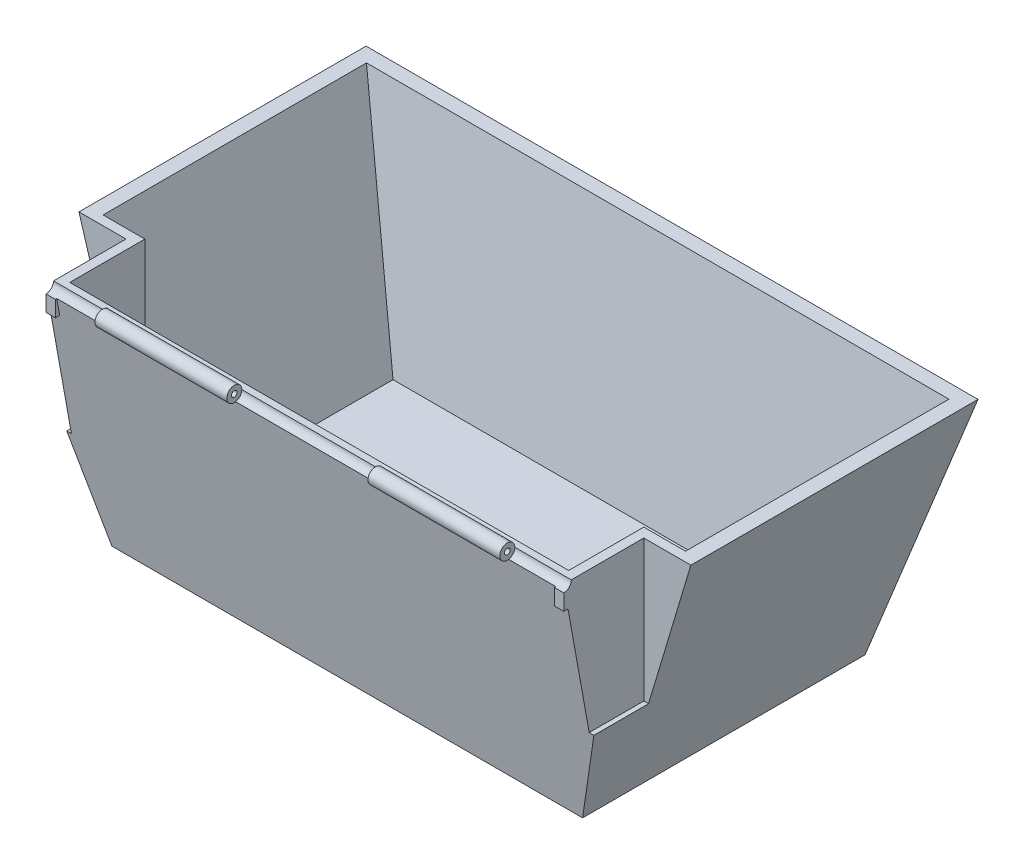
ISO-10303-21;
HEADER;
FILE_DESCRIPTION(('STEP AP214'),'2;1');
FILE_NAME('part.step','',(''),(''),'','','');
FILE_SCHEMA(('AUTOMOTIVE_DESIGN { 1 0 10303 214 1 1 1 1 }'));
ENDSEC;
DATA;
#1=APPLICATION_CONTEXT('core data for automotive mechanical design processes');
#2=APPLICATION_PROTOCOL_DEFINITION('international standard','automotive_design',2000,#1);
#3=PRODUCT_CONTEXT('',#1,'mechanical');
#4=PRODUCT('Part','Part','',(#3));
#5=PRODUCT_RELATED_PRODUCT_CATEGORY('part','',(#4));
#6=PRODUCT_DEFINITION_FORMATION('','',#4);
#7=PRODUCT_DEFINITION_CONTEXT('part definition',#1,'design');
#8=PRODUCT_DEFINITION('design','',#6,#7);
#9=PRODUCT_DEFINITION_SHAPE('','',#8);
#10=(LENGTH_UNIT() NAMED_UNIT(*) SI_UNIT(.MILLI.,.METRE.));
#11=(NAMED_UNIT(*) PLANE_ANGLE_UNIT() SI_UNIT($,.RADIAN.));
#12=(NAMED_UNIT(*) SI_UNIT($,.STERADIAN.) SOLID_ANGLE_UNIT());
#13=UNCERTAINTY_MEASURE_WITH_UNIT(LENGTH_MEASURE(1.E-05),#10,'distance_accuracy_value','');
#14=(GEOMETRIC_REPRESENTATION_CONTEXT(3) GLOBAL_UNCERTAINTY_ASSIGNED_CONTEXT((#13)) GLOBAL_UNIT_ASSIGNED_CONTEXT((#10,
#11,#12)) REPRESENTATION_CONTEXT('',''));
#15=CARTESIAN_POINT('',(0.,0.,0.));
#16=DIRECTION('',(0.,0.,1.));
#17=DIRECTION('',(1.,0.,0.));
#18=AXIS2_PLACEMENT_3D('',#15,#16,#17);
#19=CARTESIAN_POINT('',(-42.998080777364,-12.8994242332092,0.));
#20=DIRECTION('',(0.957826285221151,0.287347885566345,0.));
#21=DIRECTION('',(-0.287347885566346,0.957826285221151,0.));
#22=AXIS2_PLACEMENT_3D('',#19,#20,#21);
#23=PLANE('',#22);
#24=DIRECTION('',(-0.287347885566346,0.957826285221151,0.));
#25=VECTOR('',#24,1.);
#26=CARTESIAN_POINT('',(-42.998080777364,-12.8994242332092,20.));
#27=LINE('',#26,#25);
#28=CARTESIAN_POINT('',(-53.,20.4403065089107,20.));
#29=VERTEX_POINT('',#28);
#30=CARTESIAN_POINT('',(-61.8679080473268,50.,20.));
#31=VERTEX_POINT('',#30);
#32=EDGE_CURVE('E264',#29,#31,#27,.T.);
#33=ORIENTED_EDGE('',*,*,#32,.F.);
#34=DIRECTION('',(0.,0.,-1.));
#35=VECTOR('',#34,1.);
#36=CARTESIAN_POINT('',(-53.,20.4403065089106,0.));
#37=LINE('',#36,#35);
#38=CARTESIAN_POINT('',(-53.,20.4403065089106,30.6310425805926));
#39=VERTEX_POINT('',#38);
#40=EDGE_CURVE('E268',#39,#29,#37,.T.);
#41=ORIENTED_EDGE('',*,*,#40,.F.);
#42=DIRECTION('',(-0.283170120559138,0.943900401863794,0.169902072335483));
#43=VECTOR('',#42,1.);
#44=CARTESIAN_POINT('',(-41.8131074019733,-16.8493354845118,23.9189070217765));
#45=LINE('',#44,#43);
#46=CARTESIAN_POINT('',(-47.7679080473268,3.,27.4917874089887));
#47=VERTEX_POINT('',#46);
#48=EDGE_CURVE('E484',#47,#39,#45,.T.);
#49=ORIENTED_EDGE('',*,*,#48,.F.);
#50=DIRECTION('',(0.,0.,1.));
#51=VECTOR('',#50,1.);
#52=CARTESIAN_POINT('',(-47.7679080473268,3.,0.));
#53=LINE('',#52,#51);
#54=CARTESIAN_POINT('',(-47.7679080473268,3.,-27.4917874089887));
#55=VERTEX_POINT('',#54);
#56=EDGE_CURVE('E485',#55,#47,#53,.T.);
#57=ORIENTED_EDGE('',*,*,#56,.F.);
#58=DIRECTION('',(-0.283170120559138,0.943900401863794,-0.169902072335483));
#59=VECTOR('',#58,1.);
#60=CARTESIAN_POINT('',(-41.8131074019733,-16.8493354845118,-23.9189070217765));
#61=LINE('',#60,#59);
#62=CARTESIAN_POINT('',(-61.8679080473268,50.,-35.9517874089887));
#63=VERTEX_POINT('',#62);
#64=EDGE_CURVE('E492',#55,#63,#61,.T.);
#65=ORIENTED_EDGE('',*,*,#64,.T.);
#66=DIRECTION('',(0.,0.,1.));
#67=VECTOR('',#66,1.);
#68=CARTESIAN_POINT('',(-61.8679080473268,50.,0.));
#69=LINE('',#68,#67);
#70=EDGE_CURVE('E501',#63,#31,#69,.T.);
#71=ORIENTED_EDGE('',*,*,#70,.T.);
#72=EDGE_LOOP('',(#33,#41,#49,#57,#65,#71));
#73=FACE_BOUND('',#72,.T.);
#74=ADVANCED_FACE('F43',(#73),#23,.T.);
#75=CARTESIAN_POINT('',(42.9980807773641,-12.8994242332092,0.));
#76=DIRECTION('',(-0.957826285221151,0.287347885566345,0.));
#77=DIRECTION('',(-0.287347885566345,-0.957826285221151,0.));
#78=AXIS2_PLACEMENT_3D('',#75,#76,#77);
#79=PLANE('',#78);
#80=DIRECTION('',(0.,0.,-1.));
#81=VECTOR('',#80,1.);
#82=CARTESIAN_POINT('',(53.,20.4403065089105,0.));
#83=LINE('',#82,#81);
#84=CARTESIAN_POINT('',(53.,20.4403065089105,30.6310425805926));
#85=VERTEX_POINT('',#84);
#86=CARTESIAN_POINT('',(53.,20.4403065089105,20.));
#87=VERTEX_POINT('',#86);
#88=EDGE_CURVE('E378',#85,#87,#83,.T.);
#89=ORIENTED_EDGE('',*,*,#88,.T.);
#90=DIRECTION('',(0.287347885566345,0.957826285221151,0.));
#91=VECTOR('',#90,1.);
#92=CARTESIAN_POINT('',(42.9980807773641,-12.8994242332092,20.));
#93=LINE('',#92,#91);
#94=CARTESIAN_POINT('',(61.8679080473268,50.,20.));
#95=VERTEX_POINT('',#94);
#96=EDGE_CURVE('E12',#87,#95,#93,.T.);
#97=ORIENTED_EDGE('',*,*,#96,.T.);
#98=DIRECTION('',(0.,0.,-1.));
#99=VECTOR('',#98,1.);
#100=CARTESIAN_POINT('',(61.8679080473268,50.,0.));
#101=LINE('',#100,#99);
#102=CARTESIAN_POINT('',(61.8679080473268,50.,-35.9517874089887));
#103=VERTEX_POINT('',#102);
#104=EDGE_CURVE('E498',#95,#103,#101,.T.);
#105=ORIENTED_EDGE('',*,*,#104,.T.);
#106=DIRECTION('',(0.283170120559138,0.943900401863794,-0.169902072335483));
#107=VECTOR('',#106,1.);
#108=CARTESIAN_POINT('',(41.8131074019733,-16.8493354845118,-23.9189070217765));
#109=LINE('',#108,#107);
#110=CARTESIAN_POINT('',(47.7679080473268,3.,-27.4917874089887));
#111=VERTEX_POINT('',#110);
#112=EDGE_CURVE('E495',#111,#103,#109,.T.);
#113=ORIENTED_EDGE('',*,*,#112,.F.);
#114=DIRECTION('',(0.,0.,-1.));
#115=VECTOR('',#114,1.);
#116=CARTESIAN_POINT('',(47.7679080473268,3.,0.));
#117=LINE('',#116,#115);
#118=CARTESIAN_POINT('',(47.7679080473268,3.,27.4917874089887));
#119=VERTEX_POINT('',#118);
#120=EDGE_CURVE('E477',#119,#111,#117,.T.);
#121=ORIENTED_EDGE('',*,*,#120,.F.);
#122=DIRECTION('',(0.283170120559138,0.943900401863794,0.169902072335483));
#123=VECTOR('',#122,1.);
#124=CARTESIAN_POINT('',(41.8131074019733,-16.8493354845118,23.9189070217766));
#125=LINE('',#124,#123);
#126=EDGE_CURVE('E494',#119,#85,#125,.T.);
#127=ORIENTED_EDGE('',*,*,#126,.T.);
#128=EDGE_LOOP('',(#89,#97,#105,#113,#121,#127));
#129=FACE_BOUND('',#128,.T.);
#130=ADVANCED_FACE('F591',(#129),#79,.T.);
#131=CARTESIAN_POINT('',(55.,0.,0.));
#132=DIRECTION('',(1.,0.,0.));
#133=DIRECTION('',(0.,0.,-1.));
#134=AXIS2_PLACEMENT_3D('',#131,#132,#133);
#135=PLANE('',#134);
#136=DIRECTION('',(0.,-1.,0.));
#137=VECTOR('',#136,1.);
#138=CARTESIAN_POINT('',(55.,50.,39.));
#139=LINE('',#138,#137);
#140=CARTESIAN_POINT('',(55.,48.4,39.));
#141=VERTEX_POINT('',#140);
#142=CARTESIAN_POINT('',(55.,45.,39.));
#143=VERTEX_POINT('',#142);
#144=EDGE_CURVE('E367',#141,#143,#139,.T.);
#145=ORIENTED_EDGE('',*,*,#144,.T.);
#146=DIRECTION('',(0.,0.,-1.));
#147=VECTOR('',#146,1.);
#148=CARTESIAN_POINT('',(55.,45.,0.));
#149=LINE('',#148,#147);
#150=CARTESIAN_POINT('',(55.,45.,38.1));
#151=VERTEX_POINT('',#150);
#152=EDGE_CURVE('E278',#143,#151,#149,.T.);
#153=ORIENTED_EDGE('',*,*,#152,.T.);
#154=DIRECTION('',(0.,0.984183323973695,0.177152998315265));
#155=VECTOR('',#154,1.);
#156=CARTESIAN_POINT('',(55.,-5.23053080201473,29.0585044556373));
#157=LINE('',#156,#155);
#158=CARTESIAN_POINT('',(55.,20.,33.6));
#159=VERTEX_POINT('',#158);
#160=EDGE_CURVE('E281',#159,#151,#157,.T.);
#161=ORIENTED_EDGE('',*,*,#160,.F.);
#162=DIRECTION('',(0.,0.,-1.));
#163=VECTOR('',#162,1.);
#164=CARTESIAN_POINT('',(55.,20.,39.));
#165=LINE('',#164,#163);
#166=CARTESIAN_POINT('',(55.,20.,22.));
#167=VERTEX_POINT('',#166);
#168=EDGE_CURVE('E461',#159,#167,#165,.T.);
#169=ORIENTED_EDGE('',*,*,#168,.T.);
#170=DIRECTION('',(0.,1.,0.));
#171=VECTOR('',#170,1.);
#172=CARTESIAN_POINT('',(55.,50.,22.));
#173=LINE('',#172,#171);
#174=CARTESIAN_POINT('',(55.,50.,22.));
#175=VERTEX_POINT('',#174);
#176=EDGE_CURVE('E429',#167,#175,#173,.T.);
#177=ORIENTED_EDGE('',*,*,#176,.T.);
#178=DIRECTION('',(0.,0.,1.));
#179=VECTOR('',#178,1.);
#180=CARTESIAN_POINT('',(55.,50.,39.));
#181=LINE('',#180,#179);
#182=CARTESIAN_POINT('',(55.,50.,37.4));
#183=VERTEX_POINT('',#182);
#184=EDGE_CURVE('E425',#175,#183,#181,.T.);
#185=ORIENTED_EDGE('',*,*,#184,.T.);
#186=CARTESIAN_POINT('',(55.,50.,39.));
#187=DIRECTION('',(1.,0.,0.));
#188=DIRECTION('',(0.,0.,-1.));
#189=AXIS2_PLACEMENT_3D('',#186,#187,#188);
#190=CIRCLE('',#189,1.6);
#191=EDGE_CURVE('E307',#183,#141,#190,.F.);
#192=ORIENTED_EDGE('',*,*,#191,.T.);
#193=EDGE_LOOP('',(#145,#153,#161,#169,#177,#185,#192));
#194=FACE_BOUND('',#193,.T.);
#195=ADVANCED_FACE('F692',(#194),#135,.T.);
#196=CARTESIAN_POINT('',(-55.,0.,0.));
#197=DIRECTION('',(1.,0.,0.));
#198=DIRECTION('',(0.,0.,-1.));
#199=AXIS2_PLACEMENT_3D('',#196,#197,#198);
#200=PLANE('',#199);
#201=DIRECTION('',(0.,0.,-1.));
#202=VECTOR('',#201,1.);
#203=CARTESIAN_POINT('',(-55.,45.,0.));
#204=LINE('',#203,#202);
#205=CARTESIAN_POINT('',(-55.,45.,39.));
#206=VERTEX_POINT('',#205);
#207=CARTESIAN_POINT('',(-55.,45.,38.1));
#208=VERTEX_POINT('',#207);
#209=EDGE_CURVE('E295',#206,#208,#204,.T.);
#210=ORIENTED_EDGE('',*,*,#209,.F.);
#211=DIRECTION('',(0.,-1.,0.));
#212=VECTOR('',#211,1.);
#213=CARTESIAN_POINT('',(-55.,50.,39.));
#214=LINE('',#213,#212);
#215=CARTESIAN_POINT('',(-55.,48.4,39.));
#216=VERTEX_POINT('',#215);
#217=EDGE_CURVE('E353',#216,#206,#214,.T.);
#218=ORIENTED_EDGE('',*,*,#217,.F.);
#219=CARTESIAN_POINT('',(-55.,50.,39.));
#220=DIRECTION('',(1.,0.,0.));
#221=DIRECTION('',(0.,0.,-1.));
#222=AXIS2_PLACEMENT_3D('',#219,#220,#221);
#223=CIRCLE('',#222,1.6);
#224=CARTESIAN_POINT('',(-55.,50.,37.4));
#225=VERTEX_POINT('',#224);
#226=EDGE_CURVE('E317',#216,#225,#223,.T.);
#227=ORIENTED_EDGE('',*,*,#226,.T.);
#228=DIRECTION('',(0.,0.,1.));
#229=VECTOR('',#228,1.);
#230=CARTESIAN_POINT('',(-55.,50.,39.));
#231=LINE('',#230,#229);
#232=CARTESIAN_POINT('',(-55.,50.,22.));
#233=VERTEX_POINT('',#232);
#234=EDGE_CURVE('E434',#233,#225,#231,.T.);
#235=ORIENTED_EDGE('',*,*,#234,.F.);
#236=DIRECTION('',(0.,1.,0.));
#237=VECTOR('',#236,1.);
#238=CARTESIAN_POINT('',(-55.,50.,22.));
#239=LINE('',#238,#237);
#240=CARTESIAN_POINT('',(-55.,20.,22.));
#241=VERTEX_POINT('',#240);
#242=EDGE_CURVE('E437',#241,#233,#239,.T.);
#243=ORIENTED_EDGE('',*,*,#242,.F.);
#244=DIRECTION('',(0.,0.,-1.));
#245=VECTOR('',#244,1.);
#246=CARTESIAN_POINT('',(-55.,20.,39.));
#247=LINE('',#246,#245);
#248=CARTESIAN_POINT('',(-55.,20.,33.6));
#249=VERTEX_POINT('',#248);
#250=EDGE_CURVE('E443',#249,#241,#247,.T.);
#251=ORIENTED_EDGE('',*,*,#250,.F.);
#252=DIRECTION('',(0.,0.984183323973695,0.177152998315265));
#253=VECTOR('',#252,1.);
#254=CARTESIAN_POINT('',(-55.,-5.23053080201473,29.0585044556373));
#255=LINE('',#254,#253);
#256=EDGE_CURVE('E297',#249,#208,#255,.T.);
#257=ORIENTED_EDGE('',*,*,#256,.T.);
#258=EDGE_LOOP('',(#210,#218,#227,#235,#243,#251,#257));
#259=FACE_BOUND('',#258,.T.);
#260=ADVANCED_FACE('F654',(#259),#200,.F.);
#261=CARTESIAN_POINT('',(53.,0.,0.));
#262=DIRECTION('',(1.,0.,0.));
#263=DIRECTION('',(0.,0.,-1.));
#264=AXIS2_PLACEMENT_3D('',#261,#262,#263);
#265=PLANE('',#264);
#266=DIRECTION('',(0.,0.,-1.));
#267=VECTOR('',#266,1.);
#268=CARTESIAN_POINT('',(53.,45.,0.));
#269=LINE('',#268,#267);
#270=CARTESIAN_POINT('',(53.,45.,39.));
#271=VERTEX_POINT('',#270);
#272=CARTESIAN_POINT('',(53.,45.,38.1));
#273=VERTEX_POINT('',#272);
#274=EDGE_CURVE('E293',#271,#273,#269,.T.);
#275=ORIENTED_EDGE('',*,*,#274,.F.);
#276=DIRECTION('',(0.,-1.,0.));
#277=VECTOR('',#276,1.);
#278=CARTESIAN_POINT('',(53.,50.,39.));
#279=LINE('',#278,#277);
#280=CARTESIAN_POINT('',(53.,48.4,39.));
#281=VERTEX_POINT('',#280);
#282=EDGE_CURVE('E373',#281,#271,#279,.T.);
#283=ORIENTED_EDGE('',*,*,#282,.F.);
#284=CARTESIAN_POINT('',(53.,50.,39.));
#285=DIRECTION('',(1.,0.,0.));
#286=DIRECTION('',(0.,0.,-1.));
#287=AXIS2_PLACEMENT_3D('',#284,#285,#286);
#288=CIRCLE('',#287,1.6);
#289=CARTESIAN_POINT('',(53.,48.4253066816421,38.7165552026956));
#290=VERTEX_POINT('',#289);
#291=EDGE_CURVE('E343',#281,#290,#288,.T.);
#292=ORIENTED_EDGE('',*,*,#291,.T.);
#293=DIRECTION('',(0.,-0.984183323973695,-0.177152998315265));
#294=VECTOR('',#293,1.);
#295=CARTESIAN_POINT('',(53.,-5.23053080201472,29.0585044556373));
#296=LINE('',#295,#294);
#297=EDGE_CURVE('E402',#290,#273,#296,.T.);
#298=ORIENTED_EDGE('',*,*,#297,.T.);
#299=EDGE_LOOP('',(#275,#283,#292,#298));
#300=FACE_BOUND('',#299,.T.);
#301=ADVANCED_FACE('F793',(#300),#265,.F.);
#302=CARTESIAN_POINT('',(53.,50.,39.));
#303=DIRECTION('',(0.,0.,1.));
#304=DIRECTION('',(0.,-1.,0.));
#305=AXIS2_PLACEMENT_3D('',#302,#303,#304);
#306=PLANE('',#305);
#307=ORIENTED_EDGE('',*,*,#282,.T.);
#308=DIRECTION('',(1.,0.,0.));
#309=VECTOR('',#308,1.);
#310=CARTESIAN_POINT('',(-65.0001000000001,45.,39.));
#311=LINE('',#310,#309);
#312=EDGE_CURVE('E284',#271,#143,#311,.T.);
#313=ORIENTED_EDGE('',*,*,#312,.T.);
#314=ORIENTED_EDGE('',*,*,#144,.F.);
#315=DIRECTION('',(1.,0.,0.));
#316=VECTOR('',#315,1.);
#317=CARTESIAN_POINT('',(-59.5254833995939,48.4,39.));
#318=LINE('',#317,#316);
#319=EDGE_CURVE('E348',#281,#141,#318,.T.);
#320=ORIENTED_EDGE('',*,*,#319,.F.);
#321=EDGE_LOOP('',(#307,#313,#314,#320));
#322=FACE_BOUND('',#321,.T.);
#323=ADVANCED_FACE('F790',(#322),#306,.T.);
#324=CARTESIAN_POINT('',(-53.,0.,0.));
#325=DIRECTION('',(1.,0.,0.));
#326=DIRECTION('',(0.,0.,-1.));
#327=AXIS2_PLACEMENT_3D('',#324,#325,#326);
#328=PLANE('',#327);
#329=DIRECTION('',(0.,-1.,0.));
#330=VECTOR('',#329,1.);
#331=CARTESIAN_POINT('',(-53.,50.,39.));
#332=LINE('',#331,#330);
#333=CARTESIAN_POINT('',(-53.,48.4,39.));
#334=VERTEX_POINT('',#333);
#335=CARTESIAN_POINT('',(-53.,45.,39.));
#336=VERTEX_POINT('',#335);
#337=EDGE_CURVE('E257',#334,#336,#332,.T.);
#338=ORIENTED_EDGE('',*,*,#337,.T.);
#339=DIRECTION('',(0.,0.,-1.));
#340=VECTOR('',#339,1.);
#341=CARTESIAN_POINT('',(-53.,45.,0.));
#342=LINE('',#341,#340);
#343=CARTESIAN_POINT('',(-53.,45.,38.1));
#344=VERTEX_POINT('',#343);
#345=EDGE_CURVE('E290',#336,#344,#342,.T.);
#346=ORIENTED_EDGE('',*,*,#345,.T.);
#347=DIRECTION('',(0.,-0.984183323973695,-0.177152998315265));
#348=VECTOR('',#347,1.);
#349=CARTESIAN_POINT('',(-53.,-5.23053080201472,29.0585044556373));
#350=LINE('',#349,#348);
#351=CARTESIAN_POINT('',(-53.,48.4253066816421,38.7165552026956));
#352=VERTEX_POINT('',#351);
#353=EDGE_CURVE('E358',#352,#344,#350,.T.);
#354=ORIENTED_EDGE('',*,*,#353,.F.);
#355=CARTESIAN_POINT('',(-53.,50.,39.));
#356=DIRECTION('',(1.,0.,0.));
#357=DIRECTION('',(0.,0.,-1.));
#358=AXIS2_PLACEMENT_3D('',#355,#356,#357);
#359=CIRCLE('',#358,1.6);
#360=EDGE_CURVE('E337',#334,#352,#359,.T.);
#361=ORIENTED_EDGE('',*,*,#360,.F.);
#362=EDGE_LOOP('',(#338,#346,#354,#361));
#363=FACE_BOUND('',#362,.T.);
#364=ADVANCED_FACE('F392',(#363),#328,.T.);
#365=CARTESIAN_POINT('',(-53.,50.,39.));
#366=DIRECTION('',(0.,0.,-1.));
#367=DIRECTION('',(0.,1.,0.));
#368=AXIS2_PLACEMENT_3D('',#365,#366,#367);
#369=PLANE('',#368);
#370=DIRECTION('',(-1.,0.,0.));
#371=VECTOR('',#370,1.);
#372=CARTESIAN_POINT('',(-53.,45.,39.));
#373=LINE('',#372,#371);
#374=EDGE_CURVE('E54',#336,#206,#373,.T.);
#375=ORIENTED_EDGE('',*,*,#374,.F.);
#376=ORIENTED_EDGE('',*,*,#337,.F.);
#377=DIRECTION('',(1.,0.,0.));
#378=VECTOR('',#377,1.);
#379=CARTESIAN_POINT('',(-59.5254833995939,48.4,39.));
#380=LINE('',#379,#378);
#381=EDGE_CURVE('E368',#334,#216,#380,.F.);
#382=ORIENTED_EDGE('',*,*,#381,.T.);
#383=ORIENTED_EDGE('',*,*,#217,.T.);
#384=EDGE_LOOP('',(#375,#376,#382,#383));
#385=FACE_BOUND('',#384,.T.);
#386=ADVANCED_FACE('F397',(#385),#369,.F.);
#387=CARTESIAN_POINT('',(-59.5254833995939,50.,39.));
#388=DIRECTION('',(1.,0.,0.));
#389=DIRECTION('',(0.,0.,-1.));
#390=AXIS2_PLACEMENT_3D('',#387,#388,#389);
#391=CYLINDRICAL_SURFACE('',#390,1.6);
#392=DIRECTION('',(1.,0.,0.));
#393=VECTOR('',#392,1.);
#394=CARTESIAN_POINT('',(-59.5254833995939,48.4253066816421,38.7165552026956));
#395=LINE('',#394,#393);
#396=CARTESIAN_POINT('',(43.,48.4253066816421,38.7165552026956));
#397=VERTEX_POINT('',#396);
#398=CARTESIAN_POINT('',(15.,48.4253066816421,38.7165552026956));
#399=VERTEX_POINT('',#398);
#400=EDGE_CURVE('E344',#397,#399,#395,.F.);
#401=ORIENTED_EDGE('',*,*,#400,.F.);
#402=CARTESIAN_POINT('',(43.,50.,39.));
#403=DIRECTION('',(1.,0.,0.));
#404=DIRECTION('',(0.,0.,-1.));
#405=AXIS2_PLACEMENT_3D('',#402,#403,#404);
#406=CIRCLE('',#405,1.6);
#407=CARTESIAN_POINT('',(43.,50.,37.4));
#408=VERTEX_POINT('',#407);
#409=EDGE_CURVE('E304',#408,#397,#406,.T.);
#410=ORIENTED_EDGE('',*,*,#409,.F.);
#411=DIRECTION('',(1.,0.,0.));
#412=VECTOR('',#411,1.);
#413=CARTESIAN_POINT('',(-59.5254833995939,50.,37.4));
#414=LINE('',#413,#412);
#415=CARTESIAN_POINT('',(15.,50.,37.4));
#416=VERTEX_POINT('',#415);
#417=EDGE_CURVE('E666',#416,#408,#414,.T.);
#418=ORIENTED_EDGE('',*,*,#417,.F.);
#419=CARTESIAN_POINT('',(15.,50.,39.));
#420=DIRECTION('',(1.,0.,0.));
#421=DIRECTION('',(0.,0.,-1.));
#422=AXIS2_PLACEMENT_3D('',#419,#420,#421);
#423=CIRCLE('',#422,1.6);
#424=EDGE_CURVE('E334',#416,#399,#423,.T.);
#425=ORIENTED_EDGE('',*,*,#424,.T.);
#426=EDGE_LOOP('',(#401,#410,#418,#425));
#427=FACE_BOUND('',#426,.T.);
#428=ADVANCED_FACE('F684',(#427),#391,.T.);
#429=CARTESIAN_POINT('',(-65.0001000000001,50.,39.));
#430=DIRECTION('',(1.,0.,0.));
#431=DIRECTION('',(0.,0.,-1.));
#432=AXIS2_PLACEMENT_3D('',#429,#430,#431);
#433=CYLINDRICAL_SURFACE('',#432,0.599999999999992);
#434=CARTESIAN_POINT('',(15.,50.,39.));
#435=DIRECTION('',(1.,0.,0.));
#436=DIRECTION('',(0.,0.,-1.));
#437=AXIS2_PLACEMENT_3D('',#434,#435,#436);
#438=CIRCLE('',#437,0.599999999999992);
#439=CARTESIAN_POINT('',(15.,50.,38.4));
#440=VERTEX_POINT('',#439);
#441=EDGE_CURVE('E330',#440,#440,#438,.T.);
#442=ORIENTED_EDGE('',*,*,#441,.F.);
#443=EDGE_LOOP('',(#442));
#444=FACE_BOUND('',#443,.T.);
#445=CARTESIAN_POINT('',(43.,50.,39.));
#446=DIRECTION('',(1.,0.,0.));
#447=DIRECTION('',(0.,0.,-1.));
#448=AXIS2_PLACEMENT_3D('',#445,#446,#447);
#449=CIRCLE('',#448,0.599999999999992);
#450=CARTESIAN_POINT('',(43.,50.,38.4));
#451=VERTEX_POINT('',#450);
#452=EDGE_CURVE('E300',#451,#451,#449,.T.);
#453=ORIENTED_EDGE('',*,*,#452,.T.);
#454=EDGE_LOOP('',(#453));
#455=FACE_BOUND('',#454,.T.);
#456=ADVANCED_FACE('F807',(#444,#455),#433,.F.);
#457=CARTESIAN_POINT('',(-43.,50.,39.));
#458=DIRECTION('',(1.,0.,0.));
#459=DIRECTION('',(0.,0.,-1.));
#460=AXIS2_PLACEMENT_3D('',#457,#458,#459);
#461=CIRCLE('',#460,1.6);
#462=CARTESIAN_POINT('',(-43.,50.,37.4));
#463=VERTEX_POINT('',#462);
#464=CARTESIAN_POINT('',(-43.,48.4253066816421,38.7165552026956));
#465=VERTEX_POINT('',#464);
#466=EDGE_CURVE('E314',#463,#465,#461,.T.);
#467=ORIENTED_EDGE('',*,*,#466,.T.);
#468=CARTESIAN_POINT('',(-15.,48.4253066816421,38.7165552026956));
#469=VERTEX_POINT('',#468);
#470=EDGE_CURVE('E339',#469,#465,#395,.F.);
#471=ORIENTED_EDGE('',*,*,#470,.F.);
#472=CARTESIAN_POINT('',(-15.,50.,39.));
#473=DIRECTION('',(1.,0.,0.));
#474=DIRECTION('',(0.,0.,-1.));
#475=AXIS2_PLACEMENT_3D('',#472,#473,#474);
#476=CIRCLE('',#475,1.6);
#477=CARTESIAN_POINT('',(-15.,50.,37.4));
#478=VERTEX_POINT('',#477);
#479=EDGE_CURVE('E327',#478,#469,#476,.T.);
#480=ORIENTED_EDGE('',*,*,#479,.F.);
#481=EDGE_CURVE('E354',#463,#478,#414,.T.);
#482=ORIENTED_EDGE('',*,*,#481,.F.);
#483=EDGE_LOOP('',(#467,#471,#480,#482));
#484=FACE_BOUND('',#483,.T.);
#485=ADVANCED_FACE('F675',(#484),#391,.T.);
#486=CARTESIAN_POINT('',(-43.,50.,39.));
#487=DIRECTION('',(1.,0.,0.));
#488=DIRECTION('',(0.,0.,-1.));
#489=AXIS2_PLACEMENT_3D('',#486,#487,#488);
#490=CIRCLE('',#489,0.599999999999992);
#491=CARTESIAN_POINT('',(-43.,50.,38.4));
#492=VERTEX_POINT('',#491);
#493=EDGE_CURVE('E310',#492,#492,#490,.T.);
#494=ORIENTED_EDGE('',*,*,#493,.F.);
#495=EDGE_LOOP('',(#494));
#496=FACE_BOUND('',#495,.T.);
#497=CARTESIAN_POINT('',(-15.,50.,39.));
#498=DIRECTION('',(1.,0.,0.));
#499=DIRECTION('',(0.,0.,-1.));
#500=AXIS2_PLACEMENT_3D('',#497,#498,#499);
#501=CIRCLE('',#500,0.599999999999992);
#502=CARTESIAN_POINT('',(-15.,50.,38.4));
#503=VERTEX_POINT('',#502);
#504=EDGE_CURVE('E323',#503,#503,#501,.T.);
#505=ORIENTED_EDGE('',*,*,#504,.T.);
#506=EDGE_LOOP('',(#505));
#507=FACE_BOUND('',#506,.T.);
#508=ADVANCED_FACE('F532',(#496,#507),#433,.F.);
#509=CARTESIAN_POINT('',(0.,-5.23053080201472,29.0585044556373));
#510=DIRECTION('',(0.,0.177152998315265,-0.984183323973695));
#511=DIRECTION('',(0.,0.984183323973695,0.177152998315265));
#512=AXIS2_PLACEMENT_3D('',#509,#510,#511);
#513=PLANE('',#512);
#514=DIRECTION('',(1.,0.,0.));
#515=VECTOR('',#514,1.);
#516=CARTESIAN_POINT('',(-65.0001000000001,45.,38.1));
#517=LINE('',#516,#515);
#518=EDGE_CURVE('E285',#273,#151,#517,.T.);
#519=ORIENTED_EDGE('',*,*,#518,.F.);
#520=ORIENTED_EDGE('',*,*,#297,.F.);
#521=EDGE_CURVE('E340',#290,#397,#395,.F.);
#522=ORIENTED_EDGE('',*,*,#521,.T.);
#523=ORIENTED_EDGE('',*,*,#400,.T.);
#524=EDGE_CURVE('E345',#399,#469,#395,.F.);
#525=ORIENTED_EDGE('',*,*,#524,.T.);
#526=ORIENTED_EDGE('',*,*,#470,.T.);
#527=DIRECTION('',(1.,0.,0.));
#528=VECTOR('',#527,1.);
#529=CARTESIAN_POINT('',(-65.0001000000001,48.4253066816421,38.7165552026956));
#530=LINE('',#529,#528);
#531=EDGE_CURVE('E320',#465,#352,#530,.F.);
#532=ORIENTED_EDGE('',*,*,#531,.T.);
#533=ORIENTED_EDGE('',*,*,#353,.T.);
#534=EDGE_CURVE('E287',#208,#344,#517,.T.);
#535=ORIENTED_EDGE('',*,*,#534,.F.);
#536=ORIENTED_EDGE('',*,*,#256,.F.);
#537=DIRECTION('',(-1.,0.,0.));
#538=VECTOR('',#537,1.);
#539=CARTESIAN_POINT('',(0.,20.,33.6));
#540=LINE('',#539,#538);
#541=CARTESIAN_POINT('',(-56.,20.,33.6));
#542=VERTEX_POINT('',#541);
#543=EDGE_CURVE('E456',#249,#542,#540,.T.);
#544=ORIENTED_EDGE('',*,*,#543,.T.);
#545=DIRECTION('',(-0.283170120559138,0.943900401863794,0.169902072335483));
#546=VECTOR('',#545,1.);
#547=CARTESIAN_POINT('',(-50.,0.,30.));
#548=LINE('',#547,#546);
#549=CARTESIAN_POINT('',(-50.,0.,30.));
#550=VERTEX_POINT('',#549);
#551=EDGE_CURVE('E520',#550,#542,#548,.T.);
#552=ORIENTED_EDGE('',*,*,#551,.F.);
#553=DIRECTION('',(1.,0.,0.));
#554=VECTOR('',#553,1.);
#555=CARTESIAN_POINT('',(-50.,0.,30.));
#556=LINE('',#555,#554);
#557=CARTESIAN_POINT('',(50.,0.,30.));
#558=VERTEX_POINT('',#557);
#559=EDGE_CURVE('E514',#550,#558,#556,.T.);
#560=ORIENTED_EDGE('',*,*,#559,.T.);
#561=DIRECTION('',(0.283170120559138,0.943900401863794,0.169902072335483));
#562=VECTOR('',#561,1.);
#563=CARTESIAN_POINT('',(50.,0.,30.));
#564=LINE('',#563,#562);
#565=CARTESIAN_POINT('',(56.,20.,33.6));
#566=VERTEX_POINT('',#565);
#567=EDGE_CURVE('E633',#558,#566,#564,.T.);
#568=ORIENTED_EDGE('',*,*,#567,.T.);
#569=DIRECTION('',(1.,0.,0.));
#570=VECTOR('',#569,1.);
#571=CARTESIAN_POINT('',(0.,20.,33.6));
#572=LINE('',#571,#570);
#573=EDGE_CURVE('E473',#159,#566,#572,.T.);
#574=ORIENTED_EDGE('',*,*,#573,.F.);
#575=ORIENTED_EDGE('',*,*,#160,.T.);
#576=EDGE_LOOP('',(#519,#520,#522,#523,#525,#526,#532,#533,#535,#536,#544,#552,#560,#568,#574,#575));
#577=FACE_BOUND('',#576,.T.);
#578=ADVANCED_FACE('F522',(#577),#513,.F.);
#579=CARTESIAN_POINT('',(0.,-4.69907180706893,26.1059544837163));
#580=DIRECTION('',(0.,0.177152998315265,-0.984183323973695));
#581=DIRECTION('',(0.,0.984183323973695,0.177152998315265));
#582=AXIS2_PLACEMENT_3D('',#579,#580,#581);
#583=PLANE('',#582);
#584=DIRECTION('',(0.,-0.984183323973695,-0.177152998315265));
#585=VECTOR('',#584,1.);
#586=CARTESIAN_POINT('',(-53.,-4.69907180706893,26.1059544837163));
#587=LINE('',#586,#585);
#588=CARTESIAN_POINT('',(-53.,50.,35.9517874089887));
#589=VERTEX_POINT('',#588);
#590=EDGE_CURVE('E256',#589,#39,#587,.T.);
#591=ORIENTED_EDGE('',*,*,#590,.F.);
#592=DIRECTION('',(1.,0.,0.));
#593=VECTOR('',#592,1.);
#594=CARTESIAN_POINT('',(0.,50.,35.9517874089887));
#595=LINE('',#594,#593);
#596=CARTESIAN_POINT('',(53.,50.,35.9517874089887));
#597=VERTEX_POINT('',#596);
#598=EDGE_CURVE('E252',#589,#597,#595,.T.);
#599=ORIENTED_EDGE('',*,*,#598,.T.);
#600=DIRECTION('',(0.,-0.984183323973695,-0.177152998315265));
#601=VECTOR('',#600,1.);
#602=CARTESIAN_POINT('',(53.,-4.69907180706893,26.1059544837163));
#603=LINE('',#602,#601);
#604=EDGE_CURVE('E785',#597,#85,#603,.T.);
#605=ORIENTED_EDGE('',*,*,#604,.T.);
#606=ORIENTED_EDGE('',*,*,#126,.F.);
#607=DIRECTION('',(1.,0.,0.));
#608=VECTOR('',#607,1.);
#609=CARTESIAN_POINT('',(0.,3.,27.4917874089887));
#610=LINE('',#609,#608);
#611=EDGE_CURVE('E481',#47,#119,#610,.T.);
#612=ORIENTED_EDGE('',*,*,#611,.F.);
#613=ORIENTED_EDGE('',*,*,#48,.T.);
#614=EDGE_LOOP('',(#591,#599,#605,#606,#612,#613));
#615=FACE_BOUND('',#614,.T.);
#616=ADVANCED_FACE('F531',(#615),#583,.T.);
#617=CARTESIAN_POINT('',(0.,50.,0.));
#618=DIRECTION('',(0.,-1.,0.));
#619=DIRECTION('',(0.,0.,-1.));
#620=AXIS2_PLACEMENT_3D('',#617,#618,#619);
#621=PLANE('',#620);
#622=DIRECTION('',(1.,0.,0.));
#623=VECTOR('',#622,1.);
#624=CARTESIAN_POINT('',(-65.,50.,20.));
#625=LINE('',#624,#623);
#626=CARTESIAN_POINT('',(-53.,50.,20.));
#627=VERTEX_POINT('',#626);
#628=EDGE_CURVE('E249',#31,#627,#625,.T.);
#629=ORIENTED_EDGE('',*,*,#628,.F.);
#630=ORIENTED_EDGE('',*,*,#70,.F.);
#631=DIRECTION('',(-1.,0.,0.));
#632=VECTOR('',#631,1.);
#633=CARTESIAN_POINT('',(0.,50.,-35.9517874089887));
#634=LINE('',#633,#632);
#635=EDGE_CURVE('E503',#103,#63,#634,.T.);
#636=ORIENTED_EDGE('',*,*,#635,.F.);
#637=ORIENTED_EDGE('',*,*,#104,.F.);
#638=DIRECTION('',(1.,0.,0.));
#639=VECTOR('',#638,1.);
#640=CARTESIAN_POINT('',(65.,50.,20.));
#641=LINE('',#640,#639);
#642=CARTESIAN_POINT('',(53.,50.,20.));
#643=VERTEX_POINT('',#642);
#644=EDGE_CURVE('E270',#643,#95,#641,.T.);
#645=ORIENTED_EDGE('',*,*,#644,.F.);
#646=DIRECTION('',(0.,0.,1.));
#647=VECTOR('',#646,1.);
#648=CARTESIAN_POINT('',(53.,50.,39.));
#649=LINE('',#648,#647);
#650=EDGE_CURVE('E361',#643,#597,#649,.T.);
#651=ORIENTED_EDGE('',*,*,#650,.T.);
#652=ORIENTED_EDGE('',*,*,#598,.F.);
#653=DIRECTION('',(0.,0.,1.));
#654=VECTOR('',#653,1.);
#655=CARTESIAN_POINT('',(-53.,50.,39.));
#656=LINE('',#655,#654);
#657=EDGE_CURVE('E245',#627,#589,#656,.T.);
#658=ORIENTED_EDGE('',*,*,#657,.F.);
#659=EDGE_LOOP('',(#629,#630,#636,#637,#645,#651,#652,#658));
#660=FACE_BOUND('',#659,.T.);
#661=DIRECTION('',(0.,0.,1.));
#662=VECTOR('',#661,1.);
#663=CARTESIAN_POINT('',(-65.,50.,39.));
#664=LINE('',#663,#662);
#665=CARTESIAN_POINT('',(-65.,50.,-39.));
#666=VERTEX_POINT('',#665);
#667=CARTESIAN_POINT('',(-65.,50.,20.));
#668=VERTEX_POINT('',#667);
#669=EDGE_CURVE('E48',#666,#668,#664,.T.);
#670=ORIENTED_EDGE('',*,*,#669,.T.);
#671=CARTESIAN_POINT('',(-65.,50.,22.));
#672=VERTEX_POINT('',#671);
#673=EDGE_CURVE('E62',#668,#672,#664,.T.);
#674=ORIENTED_EDGE('',*,*,#673,.T.);
#675=DIRECTION('',(1.,0.,0.));
#676=VECTOR('',#675,1.);
#677=CARTESIAN_POINT('',(-65.0001,50.,22.));
#678=LINE('',#677,#676);
#679=EDGE_CURVE('E441',#672,#233,#678,.T.);
#680=ORIENTED_EDGE('',*,*,#679,.T.);
#681=ORIENTED_EDGE('',*,*,#234,.T.);
#682=EDGE_CURVE('E351',#225,#463,#414,.T.);
#683=ORIENTED_EDGE('',*,*,#682,.T.);
#684=ORIENTED_EDGE('',*,*,#481,.T.);
#685=EDGE_CURVE('E355',#478,#416,#414,.T.);
#686=ORIENTED_EDGE('',*,*,#685,.T.);
#687=ORIENTED_EDGE('',*,*,#417,.T.);
#688=EDGE_CURVE('E350',#408,#183,#414,.T.);
#689=ORIENTED_EDGE('',*,*,#688,.T.);
#690=ORIENTED_EDGE('',*,*,#184,.F.);
#691=DIRECTION('',(-1.,0.,0.));
#692=VECTOR('',#691,1.);
#693=CARTESIAN_POINT('',(65.0001,50.,22.));
#694=LINE('',#693,#692);
#695=CARTESIAN_POINT('',(65.,50.,22.));
#696=VERTEX_POINT('',#695);
#697=EDGE_CURVE('E428',#696,#175,#694,.T.);
#698=ORIENTED_EDGE('',*,*,#697,.F.);
#699=DIRECTION('',(0.,0.,-1.));
#700=VECTOR('',#699,1.);
#701=CARTESIAN_POINT('',(65.,50.,39.));
#702=LINE('',#701,#700);
#703=CARTESIAN_POINT('',(65.,50.,20.));
#704=VERTEX_POINT('',#703);
#705=EDGE_CURVE('E700',#696,#704,#702,.T.);
#706=ORIENTED_EDGE('',*,*,#705,.T.);
#707=CARTESIAN_POINT('',(65.,50.,-39.));
#708=VERTEX_POINT('',#707);
#709=EDGE_CURVE('E70',#704,#708,#702,.T.);
#710=ORIENTED_EDGE('',*,*,#709,.T.);
#711=DIRECTION('',(-1.,0.,0.));
#712=VECTOR('',#711,1.);
#713=CARTESIAN_POINT('',(-65.,50.,-39.));
#714=LINE('',#713,#712);
#715=EDGE_CURVE('E414',#708,#666,#714,.T.);
#716=ORIENTED_EDGE('',*,*,#715,.T.);
#717=EDGE_LOOP('',(#670,#674,#680,#681,#683,#684,#686,#687,#689,#690,#698,#706,#710,#716));
#718=FACE_BOUND('',#717,.T.);
#719=ADVANCED_FACE('F45',(#660,#718),#621,.F.);
#720=CARTESIAN_POINT('',(45.8715596330275,-13.7614678899083,0.));
#721=DIRECTION('',(-0.957826285221151,0.287347885566345,0.));
#722=DIRECTION('',(-0.287347885566345,-0.957826285221151,0.));
#723=AXIS2_PLACEMENT_3D('',#720,#721,#722);
#724=PLANE('',#723);
#725=DIRECTION('',(0.287347885566345,0.957826285221151,0.));
#726=VECTOR('',#725,1.);
#727=CARTESIAN_POINT('',(45.8715596330275,-13.7614678899083,22.));
#728=LINE('',#727,#726);
#729=CARTESIAN_POINT('',(56.,20.,22.));
#730=VERTEX_POINT('',#729);
#731=EDGE_CURVE('E471',#730,#696,#728,.T.);
#732=ORIENTED_EDGE('',*,*,#731,.F.);
#733=DIRECTION('',(0.,0.,-1.));
#734=VECTOR('',#733,1.);
#735=CARTESIAN_POINT('',(56.,20.,0.));
#736=LINE('',#735,#734);
#737=EDGE_CURVE('E417',#566,#730,#736,.T.);
#738=ORIENTED_EDGE('',*,*,#737,.F.);
#739=ORIENTED_EDGE('',*,*,#567,.F.);
#740=DIRECTION('',(0.,0.,-1.));
#741=VECTOR('',#740,1.);
#742=CARTESIAN_POINT('',(50.,0.,30.));
#743=LINE('',#742,#741);
#744=CARTESIAN_POINT('',(50.,0.,-30.));
#745=VERTEX_POINT('',#744);
#746=EDGE_CURVE('E505',#558,#745,#743,.T.);
#747=ORIENTED_EDGE('',*,*,#746,.T.);
#748=DIRECTION('',(0.283170120559138,0.943900401863794,-0.169902072335483));
#749=VECTOR('',#748,1.);
#750=CARTESIAN_POINT('',(50.,0.,-30.));
#751=LINE('',#750,#749);
#752=EDGE_CURVE('E630',#745,#708,#751,.T.);
#753=ORIENTED_EDGE('',*,*,#752,.T.);
#754=ORIENTED_EDGE('',*,*,#709,.F.);
#755=ORIENTED_EDGE('',*,*,#705,.F.);
#756=EDGE_LOOP('',(#732,#738,#739,#747,#753,#754,#755));
#757=FACE_BOUND('',#756,.T.);
#758=ADVANCED_FACE('F536',(#757),#724,.F.);
#759=CARTESIAN_POINT('',(0.,0.,0.));
#760=DIRECTION('',(0.,-1.,0.));
#761=DIRECTION('',(0.,0.,-1.));
#762=AXIS2_PLACEMENT_3D('',#759,#760,#761);
#763=PLANE('',#762);
#764=ORIENTED_EDGE('',*,*,#746,.F.);
#765=ORIENTED_EDGE('',*,*,#559,.F.);
#766=DIRECTION('',(0.,0.,1.));
#767=VECTOR('',#766,1.);
#768=CARTESIAN_POINT('',(-50.,0.,30.));
#769=LINE('',#768,#767);
#770=CARTESIAN_POINT('',(-50.,0.,-30.));
#771=VERTEX_POINT('',#770);
#772=EDGE_CURVE('E621',#771,#550,#769,.T.);
#773=ORIENTED_EDGE('',*,*,#772,.F.);
#774=DIRECTION('',(-1.,0.,0.));
#775=VECTOR('',#774,1.);
#776=CARTESIAN_POINT('',(-50.,0.,-30.));
#777=LINE('',#776,#775);
#778=EDGE_CURVE('E613',#745,#771,#777,.T.);
#779=ORIENTED_EDGE('',*,*,#778,.F.);
#780=EDGE_LOOP('',(#764,#765,#773,#779));
#781=FACE_BOUND('',#780,.T.);
#782=ADVANCED_FACE('F539',(#781),#763,.T.);
#783=CARTESIAN_POINT('',(-45.8715596330275,-13.7614678899083,0.));
#784=DIRECTION('',(0.957826285221151,0.287347885566345,0.));
#785=DIRECTION('',(-0.287347885566346,0.957826285221151,0.));
#786=AXIS2_PLACEMENT_3D('',#783,#784,#785);
#787=PLANE('',#786);
#788=DIRECTION('',(0.,0.,-1.));
#789=VECTOR('',#788,1.);
#790=CARTESIAN_POINT('',(-56.,20.,0.));
#791=LINE('',#790,#789);
#792=CARTESIAN_POINT('',(-56.,20.,22.));
#793=VERTEX_POINT('',#792);
#794=EDGE_CURVE('E424',#542,#793,#791,.T.);
#795=ORIENTED_EDGE('',*,*,#794,.T.);
#796=DIRECTION('',(-0.287347885566346,0.957826285221151,0.));
#797=VECTOR('',#796,1.);
#798=CARTESIAN_POINT('',(-45.8715596330275,-13.7614678899083,22.));
#799=LINE('',#798,#797);
#800=EDGE_CURVE('E454',#793,#672,#799,.T.);
#801=ORIENTED_EDGE('',*,*,#800,.T.);
#802=ORIENTED_EDGE('',*,*,#673,.F.);
#803=ORIENTED_EDGE('',*,*,#669,.F.);
#804=DIRECTION('',(-0.283170120559138,0.943900401863794,-0.169902072335483));
#805=VECTOR('',#804,1.);
#806=CARTESIAN_POINT('',(-50.,0.,-30.));
#807=LINE('',#806,#805);
#808=EDGE_CURVE('E629',#771,#666,#807,.T.);
#809=ORIENTED_EDGE('',*,*,#808,.F.);
#810=ORIENTED_EDGE('',*,*,#772,.T.);
#811=ORIENTED_EDGE('',*,*,#551,.T.);
#812=EDGE_LOOP('',(#795,#801,#802,#803,#809,#810,#811));
#813=FACE_BOUND('',#812,.T.);
#814=ADVANCED_FACE('F577',(#813),#787,.F.);
#815=CARTESIAN_POINT('',(0.,-5.23053080201472,-29.0585044556373));
#816=DIRECTION('',(0.,0.177152998315265,0.984183323973695));
#817=DIRECTION('',(0.,-0.984183323973695,0.177152998315265));
#818=AXIS2_PLACEMENT_3D('',#815,#816,#817);
#819=PLANE('',#818);
#820=ORIENTED_EDGE('',*,*,#808,.T.);
#821=ORIENTED_EDGE('',*,*,#715,.F.);
#822=ORIENTED_EDGE('',*,*,#752,.F.);
#823=ORIENTED_EDGE('',*,*,#778,.T.);
#824=EDGE_LOOP('',(#820,#821,#822,#823));
#825=FACE_BOUND('',#824,.T.);
#826=ADVANCED_FACE('F533',(#825),#819,.F.);
#827=CARTESIAN_POINT('',(0.,3.,0.));
#828=DIRECTION('',(0.,-1.,0.));
#829=DIRECTION('',(0.,0.,-1.));
#830=AXIS2_PLACEMENT_3D('',#827,#828,#829);
#831=PLANE('',#830);
#832=ORIENTED_EDGE('',*,*,#120,.T.);
#833=DIRECTION('',(-1.,0.,0.));
#834=VECTOR('',#833,1.);
#835=CARTESIAN_POINT('',(0.,3.,-27.4917874089887));
#836=LINE('',#835,#834);
#837=EDGE_CURVE('E480',#111,#55,#836,.T.);
#838=ORIENTED_EDGE('',*,*,#837,.T.);
#839=ORIENTED_EDGE('',*,*,#56,.T.);
#840=ORIENTED_EDGE('',*,*,#611,.T.);
#841=EDGE_LOOP('',(#832,#838,#839,#840));
#842=FACE_BOUND('',#841,.T.);
#843=ADVANCED_FACE('F751',(#842),#831,.F.);
#844=CARTESIAN_POINT('',(0.,-4.69907180706893,-26.1059544837163));
#845=DIRECTION('',(0.,0.177152998315265,0.984183323973695));
#846=DIRECTION('',(0.,-0.984183323973695,0.177152998315265));
#847=AXIS2_PLACEMENT_3D('',#844,#845,#846);
#848=PLANE('',#847);
#849=ORIENTED_EDGE('',*,*,#64,.F.);
#850=ORIENTED_EDGE('',*,*,#837,.F.);
#851=ORIENTED_EDGE('',*,*,#112,.T.);
#852=ORIENTED_EDGE('',*,*,#635,.T.);
#853=EDGE_LOOP('',(#849,#850,#851,#852));
#854=FACE_BOUND('',#853,.T.);
#855=ADVANCED_FACE('F743',(#854),#848,.T.);
#856=CARTESIAN_POINT('',(65.0001,20.,39.));
#857=DIRECTION('',(0.,1.,0.));
#858=DIRECTION('',(0.,0.,1.));
#859=AXIS2_PLACEMENT_3D('',#856,#857,#858);
#860=PLANE('',#859);
#861=ORIENTED_EDGE('',*,*,#573,.T.);
#862=ORIENTED_EDGE('',*,*,#737,.T.);
#863=DIRECTION('',(-1.,0.,0.));
#864=VECTOR('',#863,1.);
#865=CARTESIAN_POINT('',(65.0001,20.,22.));
#866=LINE('',#865,#864);
#867=EDGE_CURVE('E467',#730,#167,#866,.T.);
#868=ORIENTED_EDGE('',*,*,#867,.T.);
#869=ORIENTED_EDGE('',*,*,#168,.F.);
#870=EDGE_LOOP('',(#861,#862,#868,#869));
#871=FACE_BOUND('',#870,.T.);
#872=ADVANCED_FACE('F741',(#871),#860,.T.);
#873=CARTESIAN_POINT('',(65.0001,50.,22.));
#874=DIRECTION('',(0.,0.,1.));
#875=DIRECTION('',(0.,-1.,0.));
#876=AXIS2_PLACEMENT_3D('',#873,#874,#875);
#877=PLANE('',#876);
#878=ORIENTED_EDGE('',*,*,#731,.T.);
#879=ORIENTED_EDGE('',*,*,#697,.T.);
#880=ORIENTED_EDGE('',*,*,#176,.F.);
#881=ORIENTED_EDGE('',*,*,#867,.F.);
#882=EDGE_LOOP('',(#878,#879,#880,#881));
#883=FACE_BOUND('',#882,.T.);
#884=ADVANCED_FACE('F698',(#883),#877,.T.);
#885=CARTESIAN_POINT('',(-65.0001,20.,39.));
#886=DIRECTION('',(0.,-1.,0.));
#887=DIRECTION('',(0.,0.,-1.));
#888=AXIS2_PLACEMENT_3D('',#885,#886,#887);
#889=PLANE('',#888);
#890=ORIENTED_EDGE('',*,*,#250,.T.);
#891=DIRECTION('',(1.,0.,0.));
#892=VECTOR('',#891,1.);
#893=CARTESIAN_POINT('',(-65.0001,20.,22.));
#894=LINE('',#893,#892);
#895=EDGE_CURVE('E436',#793,#241,#894,.T.);
#896=ORIENTED_EDGE('',*,*,#895,.F.);
#897=ORIENTED_EDGE('',*,*,#794,.F.);
#898=ORIENTED_EDGE('',*,*,#543,.F.);
#899=EDGE_LOOP('',(#890,#896,#897,#898));
#900=FACE_BOUND('',#899,.T.);
#901=ADVANCED_FACE('F650',(#900),#889,.F.);
#902=CARTESIAN_POINT('',(-65.0001,50.,22.));
#903=DIRECTION('',(0.,0.,-1.));
#904=DIRECTION('',(0.,1.,0.));
#905=AXIS2_PLACEMENT_3D('',#902,#903,#904);
#906=PLANE('',#905);
#907=ORIENTED_EDGE('',*,*,#895,.T.);
#908=ORIENTED_EDGE('',*,*,#242,.T.);
#909=ORIENTED_EDGE('',*,*,#679,.F.);
#910=ORIENTED_EDGE('',*,*,#800,.F.);
#911=EDGE_LOOP('',(#907,#908,#909,#910));
#912=FACE_BOUND('',#911,.T.);
#913=ADVANCED_FACE('F652',(#912),#906,.F.);
#914=ORIENTED_EDGE('',*,*,#604,.F.);
#915=ORIENTED_EDGE('',*,*,#650,.F.);
#916=DIRECTION('',(0.,1.,0.));
#917=VECTOR('',#916,1.);
#918=CARTESIAN_POINT('',(53.,50.,20.));
#919=LINE('',#918,#917);
#920=EDGE_CURVE('E275',#87,#643,#919,.T.);
#921=ORIENTED_EDGE('',*,*,#920,.F.);
#922=ORIENTED_EDGE('',*,*,#88,.F.);
#923=EDGE_LOOP('',(#914,#915,#921,#922));
#924=FACE_BOUND('',#923,.T.);
#925=ADVANCED_FACE('F784',(#924),#265,.F.);
#926=ORIENTED_EDGE('',*,*,#657,.T.);
#927=ORIENTED_EDGE('',*,*,#590,.T.);
#928=ORIENTED_EDGE('',*,*,#40,.T.);
#929=DIRECTION('',(0.,-1.,0.));
#930=VECTOR('',#929,1.);
#931=CARTESIAN_POINT('',(-53.,50.,20.));
#932=LINE('',#931,#930);
#933=EDGE_CURVE('E262',#627,#29,#932,.T.);
#934=ORIENTED_EDGE('',*,*,#933,.F.);
#935=EDGE_LOOP('',(#926,#927,#928,#934));
#936=FACE_BOUND('',#935,.T.);
#937=ADVANCED_FACE('F266',(#936),#328,.T.);
#938=CARTESIAN_POINT('',(15.,50.,39.));
#939=DIRECTION('',(-1.,0.,0.));
#940=DIRECTION('',(0.,0.,1.));
#941=AXIS2_PLACEMENT_3D('',#938,#939,#940);
#942=CYLINDRICAL_SURFACE('',#941,1.6);
#943=ORIENTED_EDGE('',*,*,#524,.F.);
#944=EDGE_CURVE('E333',#399,#416,#423,.T.);
#945=ORIENTED_EDGE('',*,*,#944,.T.);
#946=ORIENTED_EDGE('',*,*,#685,.F.);
#947=EDGE_CURVE('E326',#469,#478,#476,.T.);
#948=ORIENTED_EDGE('',*,*,#947,.F.);
#949=EDGE_LOOP('',(#943,#945,#946,#948));
#950=FACE_BOUND('',#949,.T.);
#951=ADVANCED_FACE('F672',(#950),#942,.F.);
#952=CARTESIAN_POINT('',(15.,50.,39.));
#953=DIRECTION('',(1.,0.,0.));
#954=DIRECTION('',(0.,0.,-1.));
#955=AXIS2_PLACEMENT_3D('',#952,#953,#954);
#956=PLANE('',#955);
#957=ORIENTED_EDGE('',*,*,#424,.F.);
#958=ORIENTED_EDGE('',*,*,#944,.F.);
#959=EDGE_LOOP('',(#957,#958));
#960=FACE_BOUND('',#959,.T.);
#961=ORIENTED_EDGE('',*,*,#441,.T.);
#962=EDGE_LOOP('',(#961));
#963=FACE_BOUND('',#962,.T.);
#964=ADVANCED_FACE('F680',(#960,#963),#956,.F.);
#965=CARTESIAN_POINT('',(-15.,50.,39.));
#966=DIRECTION('',(1.,0.,0.));
#967=DIRECTION('',(0.,0.,-1.));
#968=AXIS2_PLACEMENT_3D('',#965,#966,#967);
#969=PLANE('',#968);
#970=ORIENTED_EDGE('',*,*,#504,.F.);
#971=EDGE_LOOP('',(#970));
#972=FACE_BOUND('',#971,.T.);
#973=ORIENTED_EDGE('',*,*,#479,.T.);
#974=ORIENTED_EDGE('',*,*,#947,.T.);
#975=EDGE_LOOP('',(#973,#974));
#976=FACE_BOUND('',#975,.T.);
#977=ADVANCED_FACE('F668',(#972,#976),#969,.T.);
#978=CARTESIAN_POINT('',(-65.0001000000001,50.,39.));
#979=DIRECTION('',(1.,0.,0.));
#980=DIRECTION('',(0.,0.,-1.));
#981=AXIS2_PLACEMENT_3D('',#978,#979,#980);
#982=CYLINDRICAL_SURFACE('',#981,1.6);
#983=ORIENTED_EDGE('',*,*,#226,.F.);
#984=ORIENTED_EDGE('',*,*,#381,.F.);
#985=ORIENTED_EDGE('',*,*,#360,.T.);
#986=ORIENTED_EDGE('',*,*,#531,.F.);
#987=EDGE_CURVE('E313',#465,#463,#461,.T.);
#988=ORIENTED_EDGE('',*,*,#987,.T.);
#989=ORIENTED_EDGE('',*,*,#682,.F.);
#990=EDGE_LOOP('',(#983,#984,#985,#986,#988,#989));
#991=FACE_BOUND('',#990,.T.);
#992=ADVANCED_FACE('F656',(#991),#982,.F.);
#993=CARTESIAN_POINT('',(-43.,50.,39.));
#994=DIRECTION('',(1.,0.,0.));
#995=DIRECTION('',(0.,0.,-1.));
#996=AXIS2_PLACEMENT_3D('',#993,#994,#995);
#997=PLANE('',#996);
#998=ORIENTED_EDGE('',*,*,#493,.T.);
#999=EDGE_LOOP('',(#998));
#1000=FACE_BOUND('',#999,.T.);
#1001=ORIENTED_EDGE('',*,*,#466,.F.);
#1002=ORIENTED_EDGE('',*,*,#987,.F.);
#1003=EDGE_LOOP('',(#1001,#1002));
#1004=FACE_BOUND('',#1003,.T.);
#1005=ADVANCED_FACE('F832',(#1000,#1004),#997,.F.);
#1006=CARTESIAN_POINT('',(65.0001,50.,39.));
#1007=DIRECTION('',(-1.,0.,0.));
#1008=DIRECTION('',(0.,0.,1.));
#1009=AXIS2_PLACEMENT_3D('',#1006,#1007,#1008);
#1010=CYLINDRICAL_SURFACE('',#1009,1.6);
#1011=ORIENTED_EDGE('',*,*,#688,.F.);
#1012=EDGE_CURVE('E303',#397,#408,#406,.T.);
#1013=ORIENTED_EDGE('',*,*,#1012,.F.);
#1014=ORIENTED_EDGE('',*,*,#521,.F.);
#1015=ORIENTED_EDGE('',*,*,#291,.F.);
#1016=ORIENTED_EDGE('',*,*,#319,.T.);
#1017=ORIENTED_EDGE('',*,*,#191,.F.);
#1018=EDGE_LOOP('',(#1011,#1013,#1014,#1015,#1016,#1017));
#1019=FACE_BOUND('',#1018,.T.);
#1020=ADVANCED_FACE('F798',(#1019),#1010,.F.);
#1021=CARTESIAN_POINT('',(43.,50.,39.));
#1022=DIRECTION('',(1.,0.,0.));
#1023=DIRECTION('',(0.,0.,-1.));
#1024=AXIS2_PLACEMENT_3D('',#1021,#1022,#1023);
#1025=PLANE('',#1024);
#1026=ORIENTED_EDGE('',*,*,#409,.T.);
#1027=ORIENTED_EDGE('',*,*,#1012,.T.);
#1028=EDGE_LOOP('',(#1026,#1027));
#1029=FACE_BOUND('',#1028,.T.);
#1030=ORIENTED_EDGE('',*,*,#452,.F.);
#1031=EDGE_LOOP('',(#1030));
#1032=FACE_BOUND('',#1031,.T.);
#1033=ADVANCED_FACE('F800',(#1029,#1032),#1025,.T.);
#1034=CARTESIAN_POINT('',(-65.0001000000001,45.,0.));
#1035=DIRECTION('',(0.,-1.,0.));
#1036=DIRECTION('',(0.,0.,-1.));
#1037=AXIS2_PLACEMENT_3D('',#1034,#1035,#1036);
#1038=PLANE('',#1037);
#1039=ORIENTED_EDGE('',*,*,#209,.T.);
#1040=ORIENTED_EDGE('',*,*,#534,.T.);
#1041=ORIENTED_EDGE('',*,*,#345,.F.);
#1042=ORIENTED_EDGE('',*,*,#374,.T.);
#1043=EDGE_LOOP('',(#1039,#1040,#1041,#1042));
#1044=FACE_BOUND('',#1043,.T.);
#1045=ADVANCED_FACE('F803',(#1044),#1038,.T.);
#1046=ORIENTED_EDGE('',*,*,#274,.T.);
#1047=ORIENTED_EDGE('',*,*,#518,.T.);
#1048=ORIENTED_EDGE('',*,*,#152,.F.);
#1049=ORIENTED_EDGE('',*,*,#312,.F.);
#1050=EDGE_LOOP('',(#1046,#1047,#1048,#1049));
#1051=FACE_BOUND('',#1050,.T.);
#1052=ADVANCED_FACE('F797',(#1051),#1038,.T.);
#1053=CARTESIAN_POINT('',(0.,0.,20.));
#1054=DIRECTION('',(0.,0.,1.));
#1055=DIRECTION('',(0.,-1.,0.));
#1056=AXIS2_PLACEMENT_3D('',#1053,#1054,#1055);
#1057=PLANE('',#1056);
#1058=ORIENTED_EDGE('',*,*,#96,.F.);
#1059=ORIENTED_EDGE('',*,*,#920,.T.);
#1060=ORIENTED_EDGE('',*,*,#644,.T.);
#1061=EDGE_LOOP('',(#1058,#1059,#1060));
#1062=FACE_BOUND('',#1061,.T.);
#1063=ADVANCED_FACE('F782',(#1062),#1057,.F.);
#1064=CARTESIAN_POINT('',(0.,0.,20.));
#1065=DIRECTION('',(0.,0.,-1.));
#1066=DIRECTION('',(0.,1.,0.));
#1067=AXIS2_PLACEMENT_3D('',#1064,#1065,#1066);
#1068=PLANE('',#1067);
#1069=ORIENTED_EDGE('',*,*,#933,.T.);
#1070=ORIENTED_EDGE('',*,*,#32,.T.);
#1071=ORIENTED_EDGE('',*,*,#628,.T.);
#1072=EDGE_LOOP('',(#1069,#1070,#1071));
#1073=FACE_BOUND('',#1072,.T.);
#1074=ADVANCED_FACE('F261',(#1073),#1068,.T.);
#1075=CLOSED_SHELL('',(#74,#130,#195,#260,#301,#323,#364,#386,#428,#456,#485,#508,#578,#616,
#719,#758,#782,#814,#826,#843,#855,#872,#884,#901,#913,#925,#937,#951,#964,#977,#992,#1005,
#1020,#1033,#1045,#1052,#1063,#1074));
#1076=MANIFOLD_SOLID_BREP('B2',#1075);
#1077=ADVANCED_BREP_SHAPE_REPRESENTATION('',(#18,#1076),#14);
#1078=SHAPE_DEFINITION_REPRESENTATION(#9,#1077);
ENDSEC;
END-ISO-10303-21;
